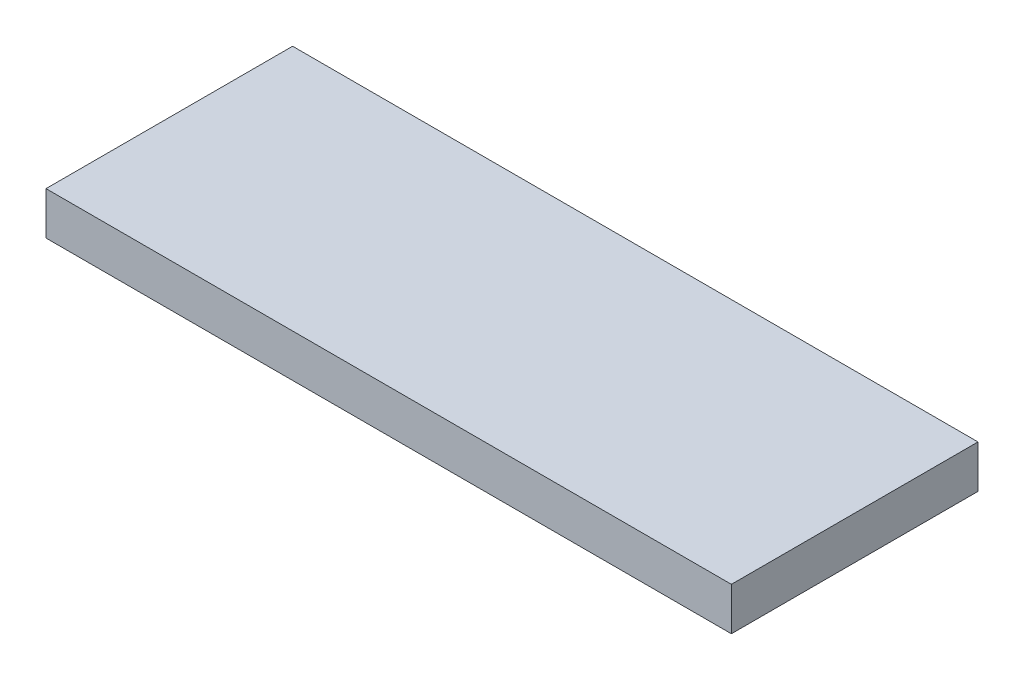
ISO-10303-21;
HEADER;
FILE_DESCRIPTION(('STEP AP214'),'2;1');
FILE_NAME('part.step','',(''),(''),'','','');
FILE_SCHEMA(('AUTOMOTIVE_DESIGN { 1 0 10303 214 1 1 1 1 }'));
ENDSEC;
DATA;
#1=APPLICATION_CONTEXT('core data for automotive mechanical design processes');
#2=APPLICATION_PROTOCOL_DEFINITION('international standard','automotive_design',2000,#1);
#3=PRODUCT_CONTEXT('',#1,'mechanical');
#4=PRODUCT('Part','Part','',(#3));
#5=PRODUCT_RELATED_PRODUCT_CATEGORY('part','',(#4));
#6=PRODUCT_DEFINITION_FORMATION('','',#4);
#7=PRODUCT_DEFINITION_CONTEXT('part definition',#1,'design');
#8=PRODUCT_DEFINITION('design','',#6,#7);
#9=PRODUCT_DEFINITION_SHAPE('','',#8);
#10=(LENGTH_UNIT() NAMED_UNIT(*) SI_UNIT(.MILLI.,.METRE.));
#11=(NAMED_UNIT(*) PLANE_ANGLE_UNIT() SI_UNIT($,.RADIAN.));
#12=(NAMED_UNIT(*) SI_UNIT($,.STERADIAN.) SOLID_ANGLE_UNIT());
#13=UNCERTAINTY_MEASURE_WITH_UNIT(LENGTH_MEASURE(1.E-05),#10,'distance_accuracy_value','');
#14=(GEOMETRIC_REPRESENTATION_CONTEXT(3) GLOBAL_UNCERTAINTY_ASSIGNED_CONTEXT((#13)) GLOBAL_UNIT_ASSIGNED_CONTEXT((#10,
#11,#12)) REPRESENTATION_CONTEXT('',''));
#15=CARTESIAN_POINT('',(0.,0.,0.));
#16=DIRECTION('',(0.,0.,1.));
#17=DIRECTION('',(1.,0.,0.));
#18=AXIS2_PLACEMENT_3D('',#15,#16,#17);
#19=CARTESIAN_POINT('',(-35.3878512641349,1.27,3.65576975869163));
#20=DIRECTION('',(-1.,0.,0.));
#21=DIRECTION('',(0.,0.,1.));
#22=AXIS2_PLACEMENT_3D('',#19,#20,#21);
#23=PLANE('',#22);
#24=DIRECTION('',(0.,0.,-1.));
#25=VECTOR('',#24,1.);
#26=CARTESIAN_POINT('',(-35.3878512641349,0.,3.65576975869163));
#27=LINE('',#26,#25);
#28=CARTESIAN_POINT('',(-35.3878512641349,0.,3.65576975869163));
#29=VERTEX_POINT('',#28);
#30=CARTESIAN_POINT('',(-35.3878512641349,0.,-3.65576975869163));
#31=VERTEX_POINT('',#30);
#32=EDGE_CURVE('E98',#29,#31,#27,.T.);
#33=ORIENTED_EDGE('',*,*,#32,.F.);
#34=DIRECTION('',(0.,-1.,0.));
#35=VECTOR('',#34,1.);
#36=CARTESIAN_POINT('',(-35.3878512641349,1.27,3.65576975869163));
#37=LINE('',#36,#35);
#38=CARTESIAN_POINT('',(-35.3878512641349,1.27,3.65576975869163));
#39=VERTEX_POINT('',#38);
#40=EDGE_CURVE('E11',#39,#29,#37,.T.);
#41=ORIENTED_EDGE('',*,*,#40,.F.);
#42=DIRECTION('',(0.,0.,-1.));
#43=VECTOR('',#42,1.);
#44=CARTESIAN_POINT('',(-35.3878512641349,1.27,3.65576975869163));
#45=LINE('',#44,#43);
#46=CARTESIAN_POINT('',(-35.3878512641349,1.27,-3.65576975869163));
#47=VERTEX_POINT('',#46);
#48=EDGE_CURVE('E93',#39,#47,#45,.T.);
#49=ORIENTED_EDGE('',*,*,#48,.T.);
#50=DIRECTION('',(0.,-1.,0.));
#51=VECTOR('',#50,1.);
#52=CARTESIAN_POINT('',(-35.3878512641349,1.27,-3.65576975869163));
#53=LINE('',#52,#51);
#54=EDGE_CURVE('E36',#47,#31,#53,.T.);
#55=ORIENTED_EDGE('',*,*,#54,.T.);
#56=EDGE_LOOP('',(#33,#41,#49,#55));
#57=FACE_BOUND('',#56,.T.);
#58=ADVANCED_FACE('F33',(#57),#23,.T.);
#59=CARTESIAN_POINT('',(-35.3878512641349,1.27,3.65576975869163));
#60=DIRECTION('',(0.,0.,-1.));
#61=DIRECTION('',(-1.,0.,0.));
#62=AXIS2_PLACEMENT_3D('',#59,#60,#61);
#63=PLANE('',#62);
#64=DIRECTION('',(1.,0.,0.));
#65=VECTOR('',#64,1.);
#66=CARTESIAN_POINT('',(-35.3878512641349,0.,3.65576975869163));
#67=LINE('',#66,#65);
#68=CARTESIAN_POINT('',(-15.0678512641349,0.,3.65576975869163));
#69=VERTEX_POINT('',#68);
#70=EDGE_CURVE('E66',#29,#69,#67,.T.);
#71=ORIENTED_EDGE('',*,*,#70,.T.);
#72=DIRECTION('',(0.,-1.,0.));
#73=VECTOR('',#72,1.);
#74=CARTESIAN_POINT('',(-15.0678512641349,1.27,3.65576975869163));
#75=LINE('',#74,#73);
#76=CARTESIAN_POINT('',(-15.0678512641349,1.27,3.65576975869163));
#77=VERTEX_POINT('',#76);
#78=EDGE_CURVE('E42',#77,#69,#75,.T.);
#79=ORIENTED_EDGE('',*,*,#78,.F.);
#80=DIRECTION('',(1.,0.,0.));
#81=VECTOR('',#80,1.);
#82=CARTESIAN_POINT('',(-35.3878512641349,1.27,3.65576975869163));
#83=LINE('',#82,#81);
#84=EDGE_CURVE('E83',#39,#77,#83,.T.);
#85=ORIENTED_EDGE('',*,*,#84,.F.);
#86=ORIENTED_EDGE('',*,*,#40,.T.);
#87=EDGE_LOOP('',(#71,#79,#85,#86));
#88=FACE_BOUND('',#87,.T.);
#89=ADVANCED_FACE('F108',(#88),#63,.F.);
#90=CARTESIAN_POINT('',(-15.0678512641349,1.27,3.65576975869163));
#91=DIRECTION('',(-1.,0.,0.));
#92=DIRECTION('',(0.,0.,1.));
#93=AXIS2_PLACEMENT_3D('',#90,#91,#92);
#94=PLANE('',#93);
#95=DIRECTION('',(0.,0.,-1.));
#96=VECTOR('',#95,1.);
#97=CARTESIAN_POINT('',(-15.0678512641349,0.,3.65576975869163));
#98=LINE('',#97,#96);
#99=CARTESIAN_POINT('',(-15.0678512641349,0.,-3.65576975869163));
#100=VERTEX_POINT('',#99);
#101=EDGE_CURVE('E90',#69,#100,#98,.T.);
#102=ORIENTED_EDGE('',*,*,#101,.T.);
#103=DIRECTION('',(0.,-1.,0.));
#104=VECTOR('',#103,1.);
#105=CARTESIAN_POINT('',(-15.0678512641349,1.27,-3.65576975869163));
#106=LINE('',#105,#104);
#107=CARTESIAN_POINT('',(-15.0678512641349,1.27,-3.65576975869163));
#108=VERTEX_POINT('',#107);
#109=EDGE_CURVE('E87',#108,#100,#106,.T.);
#110=ORIENTED_EDGE('',*,*,#109,.F.);
#111=DIRECTION('',(0.,0.,-1.));
#112=VECTOR('',#111,1.);
#113=CARTESIAN_POINT('',(-15.0678512641349,1.27,3.65576975869163));
#114=LINE('',#113,#112);
#115=EDGE_CURVE('E78',#77,#108,#114,.T.);
#116=ORIENTED_EDGE('',*,*,#115,.F.);
#117=ORIENTED_EDGE('',*,*,#78,.T.);
#118=EDGE_LOOP('',(#102,#110,#116,#117));
#119=FACE_BOUND('',#118,.T.);
#120=ADVANCED_FACE('F88',(#119),#94,.F.);
#121=CARTESIAN_POINT('',(-35.3878512641349,1.27,-3.65576975869163));
#122=DIRECTION('',(0.,0.,-1.));
#123=DIRECTION('',(-1.,0.,0.));
#124=AXIS2_PLACEMENT_3D('',#121,#122,#123);
#125=PLANE('',#124);
#126=DIRECTION('',(1.,0.,0.));
#127=VECTOR('',#126,1.);
#128=CARTESIAN_POINT('',(-35.3878512641349,0.,-3.65576975869163));
#129=LINE('',#128,#127);
#130=EDGE_CURVE('E101',#31,#100,#129,.T.);
#131=ORIENTED_EDGE('',*,*,#130,.F.);
#132=ORIENTED_EDGE('',*,*,#54,.F.);
#133=DIRECTION('',(1.,0.,0.));
#134=VECTOR('',#133,1.);
#135=CARTESIAN_POINT('',(-35.3878512641349,1.27,-3.65576975869163));
#136=LINE('',#135,#134);
#137=EDGE_CURVE('E82',#47,#108,#136,.T.);
#138=ORIENTED_EDGE('',*,*,#137,.T.);
#139=ORIENTED_EDGE('',*,*,#109,.T.);
#140=EDGE_LOOP('',(#131,#132,#138,#139));
#141=FACE_BOUND('',#140,.T.);
#142=ADVANCED_FACE('F92',(#141),#125,.T.);
#143=CARTESIAN_POINT('',(0.,1.27,0.));
#144=DIRECTION('',(0.,-1.,0.));
#145=DIRECTION('',(0.,0.,-1.));
#146=AXIS2_PLACEMENT_3D('',#143,#144,#145);
#147=PLANE('',#146);
#148=ORIENTED_EDGE('',*,*,#48,.F.);
#149=ORIENTED_EDGE('',*,*,#84,.T.);
#150=ORIENTED_EDGE('',*,*,#115,.T.);
#151=ORIENTED_EDGE('',*,*,#137,.F.);
#152=EDGE_LOOP('',(#148,#149,#150,#151));
#153=FACE_BOUND('',#152,.T.);
#154=ADVANCED_FACE('F81',(#153),#147,.F.);
#155=CARTESIAN_POINT('',(0.,0.,0.));
#156=DIRECTION('',(0.,-1.,0.));
#157=DIRECTION('',(0.,0.,-1.));
#158=AXIS2_PLACEMENT_3D('',#155,#156,#157);
#159=PLANE('',#158);
#160=ORIENTED_EDGE('',*,*,#32,.T.);
#161=ORIENTED_EDGE('',*,*,#130,.T.);
#162=ORIENTED_EDGE('',*,*,#101,.F.);
#163=ORIENTED_EDGE('',*,*,#70,.F.);
#164=EDGE_LOOP('',(#160,#161,#162,#163));
#165=FACE_BOUND('',#164,.T.);
#166=ADVANCED_FACE('F106',(#165),#159,.T.);
#167=CLOSED_SHELL('',(#58,#89,#120,#142,#154,#166));
#168=MANIFOLD_SOLID_BREP('B2',#167);
#169=ADVANCED_BREP_SHAPE_REPRESENTATION('',(#18,#168),#14);
#170=SHAPE_DEFINITION_REPRESENTATION(#9,#169);
ENDSEC;
END-ISO-10303-21;
